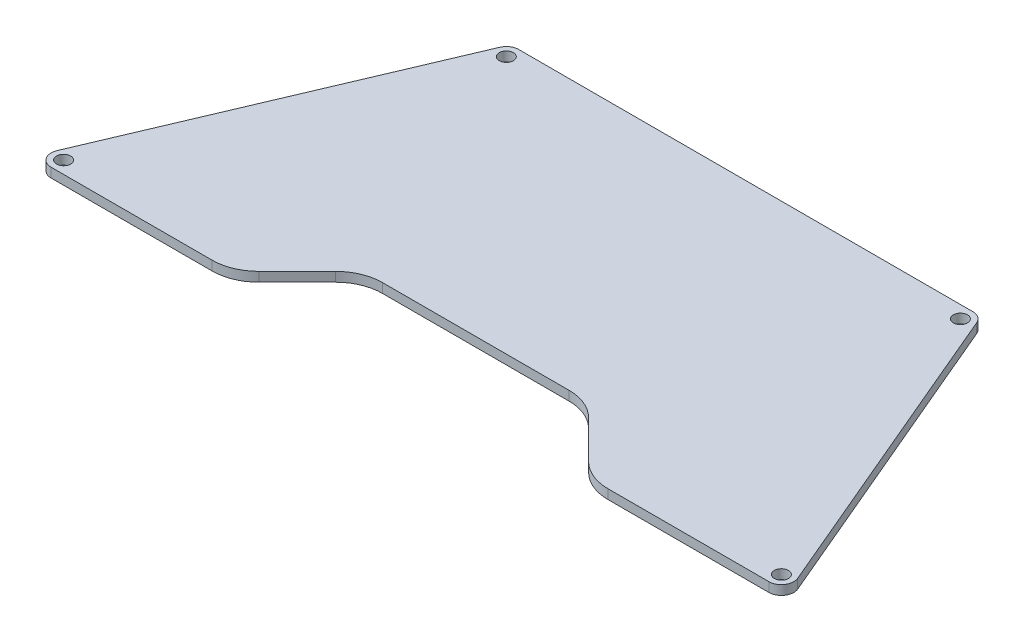
ISO-10303-21;
HEADER;
FILE_DESCRIPTION(('STEP AP214'),'2;1');
FILE_NAME('part.step','',(''),(''),'','','');
FILE_SCHEMA(('AUTOMOTIVE_DESIGN { 1 0 10303 214 1 1 1 1 }'));
ENDSEC;
DATA;
#1=APPLICATION_CONTEXT('core data for automotive mechanical design processes');
#2=APPLICATION_PROTOCOL_DEFINITION('international standard','automotive_design',2000,#1);
#3=PRODUCT_CONTEXT('',#1,'mechanical');
#4=PRODUCT('Part','Part','',(#3));
#5=PRODUCT_RELATED_PRODUCT_CATEGORY('part','',(#4));
#6=PRODUCT_DEFINITION_FORMATION('','',#4);
#7=PRODUCT_DEFINITION_CONTEXT('part definition',#1,'design');
#8=PRODUCT_DEFINITION('design','',#6,#7);
#9=PRODUCT_DEFINITION_SHAPE('','',#8);
#10=(LENGTH_UNIT() NAMED_UNIT(*) SI_UNIT(.MILLI.,.METRE.));
#11=(NAMED_UNIT(*) PLANE_ANGLE_UNIT() SI_UNIT($,.RADIAN.));
#12=(NAMED_UNIT(*) SI_UNIT($,.STERADIAN.) SOLID_ANGLE_UNIT());
#13=UNCERTAINTY_MEASURE_WITH_UNIT(LENGTH_MEASURE(1.E-05),#10,'distance_accuracy_value','');
#14=(GEOMETRIC_REPRESENTATION_CONTEXT(3) GLOBAL_UNCERTAINTY_ASSIGNED_CONTEXT((#13)) GLOBAL_UNIT_ASSIGNED_CONTEXT((#10,
#11,#12)) REPRESENTATION_CONTEXT('',''));
#15=CARTESIAN_POINT('',(0.,0.,0.));
#16=DIRECTION('',(0.,0.,1.));
#17=DIRECTION('',(1.,0.,0.));
#18=AXIS2_PLACEMENT_3D('',#15,#16,#17);
#19=CARTESIAN_POINT('',(118.532635623731,2.,-7.35));
#20=DIRECTION('',(0.,1.,0.));
#21=DIRECTION('',(0.,0.,1.));
#22=AXIS2_PLACEMENT_3D('',#19,#20,#21);
#23=CYLINDRICAL_SURFACE('',#22,10.);
#24=DIRECTION('',(0.,1.,0.));
#25=VECTOR('',#24,1.);
#26=CARTESIAN_POINT('',(111.461567811865,2.,-0.278932188134528));
#27=LINE('',#26,#25);
#28=CARTESIAN_POINT('',(111.461567811865,0.,-0.278932188134535));
#29=VERTEX_POINT('',#28);
#30=CARTESIAN_POINT('',(111.461567811865,2.,-0.278932188134535));
#31=VERTEX_POINT('',#30);
#32=EDGE_CURVE('E198',#29,#31,#27,.T.);
#33=ORIENTED_EDGE('',*,*,#32,.F.);
#34=CARTESIAN_POINT('',(118.532635623731,0.,-7.35));
#35=DIRECTION('',(0.,1.,0.));
#36=DIRECTION('',(0.,0.,1.));
#37=AXIS2_PLACEMENT_3D('',#34,#35,#36);
#38=CIRCLE('',#37,10.);
#39=CARTESIAN_POINT('',(118.532635623731,0.,2.65));
#40=VERTEX_POINT('',#39);
#41=EDGE_CURVE('E40',#40,#29,#38,.F.);
#42=ORIENTED_EDGE('',*,*,#41,.F.);
#43=DIRECTION('',(0.,1.,0.));
#44=VECTOR('',#43,1.);
#45=CARTESIAN_POINT('',(118.532635623731,2.,2.65));
#46=LINE('',#45,#44);
#47=CARTESIAN_POINT('',(118.532635623731,2.,2.65));
#48=VERTEX_POINT('',#47);
#49=EDGE_CURVE('E201',#48,#40,#46,.F.);
#50=ORIENTED_EDGE('',*,*,#49,.F.);
#51=CARTESIAN_POINT('',(118.532635623731,2.,-7.35));
#52=DIRECTION('',(0.,1.,0.));
#53=DIRECTION('',(0.,0.,1.));
#54=AXIS2_PLACEMENT_3D('',#51,#52,#53);
#55=CIRCLE('',#54,10.);
#56=EDGE_CURVE('E11',#31,#48,#55,.T.);
#57=ORIENTED_EDGE('',*,*,#56,.F.);
#58=EDGE_LOOP('',(#33,#42,#50,#57));
#59=FACE_BOUND('',#58,.T.);
#60=ADVANCED_FACE('F33',(#59),#23,.T.);
#61=CARTESIAN_POINT('',(96.248364376269,2.,-1.35));
#62=DIRECTION('',(0.,-1.,0.));
#63=DIRECTION('',(0.,0.,-1.));
#64=AXIS2_PLACEMENT_3D('',#61,#62,#63);
#65=CYLINDRICAL_SURFACE('',#64,10.);
#66=DIRECTION('',(0.,1.,0.));
#67=VECTOR('',#66,1.);
#68=CARTESIAN_POINT('',(96.248364376269,2.,-11.35));
#69=LINE('',#68,#67);
#70=CARTESIAN_POINT('',(96.2483643762691,0.,-11.35));
#71=VERTEX_POINT('',#70);
#72=CARTESIAN_POINT('',(96.2483643762691,2.,-11.35));
#73=VERTEX_POINT('',#72);
#74=EDGE_CURVE('E188',#71,#73,#69,.T.);
#75=ORIENTED_EDGE('',*,*,#74,.F.);
#76=CARTESIAN_POINT('',(96.248364376269,0.,-1.35));
#77=DIRECTION('',(0.,1.,0.));
#78=DIRECTION('',(0.,0.,1.));
#79=AXIS2_PLACEMENT_3D('',#76,#77,#78);
#80=CIRCLE('',#79,10.);
#81=CARTESIAN_POINT('',(103.319432188135,0.,-8.42106781186546));
#82=VERTEX_POINT('',#81);
#83=EDGE_CURVE('E194',#71,#82,#80,.F.);
#84=ORIENTED_EDGE('',*,*,#83,.T.);
#85=DIRECTION('',(0.,1.,0.));
#86=VECTOR('',#85,1.);
#87=CARTESIAN_POINT('',(103.319432188135,2.,-8.42106781186547));
#88=LINE('',#87,#86);
#89=CARTESIAN_POINT('',(103.319432188135,2.,-8.42106781186546));
#90=VERTEX_POINT('',#89);
#91=EDGE_CURVE('E191',#90,#82,#88,.F.);
#92=ORIENTED_EDGE('',*,*,#91,.F.);
#93=CARTESIAN_POINT('',(96.248364376269,2.,-1.35));
#94=DIRECTION('',(0.,1.,0.));
#95=DIRECTION('',(0.,0.,1.));
#96=AXIS2_PLACEMENT_3D('',#93,#94,#95);
#97=CIRCLE('',#96,10.);
#98=EDGE_CURVE('E196',#90,#73,#97,.T.);
#99=ORIENTED_EDGE('',*,*,#98,.T.);
#100=EDGE_LOOP('',(#75,#84,#92,#99));
#101=FACE_BOUND('',#100,.T.);
#102=ADVANCED_FACE('F318',(#101),#65,.F.);
#103=CARTESIAN_POINT('',(56.532635623731,2.,-1.35));
#104=DIRECTION('',(0.,-1.,0.));
#105=DIRECTION('',(0.,0.,-1.));
#106=AXIS2_PLACEMENT_3D('',#103,#104,#105);
#107=CYLINDRICAL_SURFACE('',#106,10.);
#108=DIRECTION('',(0.,1.,0.));
#109=VECTOR('',#108,1.);
#110=CARTESIAN_POINT('',(49.4615678118655,2.,-8.42106781186546));
#111=LINE('',#110,#109);
#112=CARTESIAN_POINT('',(49.4615678118655,0.,-8.42106781186546));
#113=VERTEX_POINT('',#112);
#114=CARTESIAN_POINT('',(49.4615678118655,2.,-8.42106781186546));
#115=VERTEX_POINT('',#114);
#116=EDGE_CURVE('E178',#113,#115,#111,.T.);
#117=ORIENTED_EDGE('',*,*,#116,.F.);
#118=CARTESIAN_POINT('',(56.532635623731,0.,-1.35));
#119=DIRECTION('',(0.,1.,0.));
#120=DIRECTION('',(0.,0.,1.));
#121=AXIS2_PLACEMENT_3D('',#118,#119,#120);
#122=CIRCLE('',#121,10.);
#123=CARTESIAN_POINT('',(56.532635623731,0.,-11.35));
#124=VERTEX_POINT('',#123);
#125=EDGE_CURVE('E184',#113,#124,#122,.F.);
#126=ORIENTED_EDGE('',*,*,#125,.T.);
#127=DIRECTION('',(0.,1.,0.));
#128=VECTOR('',#127,1.);
#129=CARTESIAN_POINT('',(56.532635623731,2.,-11.35));
#130=LINE('',#129,#128);
#131=CARTESIAN_POINT('',(56.532635623731,2.,-11.35));
#132=VERTEX_POINT('',#131);
#133=EDGE_CURVE('E181',#132,#124,#130,.F.);
#134=ORIENTED_EDGE('',*,*,#133,.F.);
#135=CARTESIAN_POINT('',(56.532635623731,2.,-1.35));
#136=DIRECTION('',(0.,1.,0.));
#137=DIRECTION('',(0.,0.,1.));
#138=AXIS2_PLACEMENT_3D('',#135,#136,#137);
#139=CIRCLE('',#138,10.);
#140=EDGE_CURVE('E186',#132,#115,#139,.T.);
#141=ORIENTED_EDGE('',*,*,#140,.T.);
#142=EDGE_LOOP('',(#117,#126,#134,#141));
#143=FACE_BOUND('',#142,.T.);
#144=ADVANCED_FACE('F275',(#143),#107,.F.);
#145=CARTESIAN_POINT('',(34.2483643762691,2.,-7.35));
#146=DIRECTION('',(0.,1.,0.));
#147=DIRECTION('',(0.,0.,1.));
#148=AXIS2_PLACEMENT_3D('',#145,#146,#147);
#149=CYLINDRICAL_SURFACE('',#148,10.);
#150=DIRECTION('',(0.,1.,0.));
#151=VECTOR('',#150,1.);
#152=CARTESIAN_POINT('',(34.2483643762691,2.,2.65));
#153=LINE('',#152,#151);
#154=CARTESIAN_POINT('',(34.2483643762691,0.,2.65));
#155=VERTEX_POINT('',#154);
#156=CARTESIAN_POINT('',(34.2483643762691,2.,2.65));
#157=VERTEX_POINT('',#156);
#158=EDGE_CURVE('E163',#155,#157,#153,.T.);
#159=ORIENTED_EDGE('',*,*,#158,.F.);
#160=CARTESIAN_POINT('',(34.2483643762691,0.,-7.35));
#161=DIRECTION('',(0.,1.,0.));
#162=DIRECTION('',(0.,0.,1.));
#163=AXIS2_PLACEMENT_3D('',#160,#161,#162);
#164=CIRCLE('',#163,10.);
#165=CARTESIAN_POINT('',(41.3194321881346,0.,-0.27893218813454));
#166=VERTEX_POINT('',#165);
#167=EDGE_CURVE('E174',#166,#155,#164,.F.);
#168=ORIENTED_EDGE('',*,*,#167,.F.);
#169=DIRECTION('',(0.,1.,0.));
#170=VECTOR('',#169,1.);
#171=CARTESIAN_POINT('',(41.3194321881346,2.,-0.278932188134544));
#172=LINE('',#171,#170);
#173=CARTESIAN_POINT('',(41.3194321881346,2.,-0.27893218813454));
#174=VERTEX_POINT('',#173);
#175=EDGE_CURVE('E166',#174,#166,#172,.F.);
#176=ORIENTED_EDGE('',*,*,#175,.F.);
#177=CARTESIAN_POINT('',(34.2483643762691,2.,-7.35));
#178=DIRECTION('',(0.,1.,0.));
#179=DIRECTION('',(0.,0.,1.));
#180=AXIS2_PLACEMENT_3D('',#177,#178,#179);
#181=CIRCLE('',#180,10.);
#182=EDGE_CURVE('E176',#157,#174,#181,.T.);
#183=ORIENTED_EDGE('',*,*,#182,.F.);
#184=EDGE_LOOP('',(#159,#168,#176,#183));
#185=FACE_BOUND('',#184,.T.);
#186=ADVANCED_FACE('F310',(#185),#149,.T.);
#187=CARTESIAN_POINT('',(152.781,2.,0.));
#188=DIRECTION('',(0.,1.,0.));
#189=DIRECTION('',(0.,0.,1.));
#190=AXIS2_PLACEMENT_3D('',#187,#188,#189);
#191=PLANE('',#190);
#192=DIRECTION('',(0.707106781186546,0.,0.707106781186549));
#193=VECTOR('',#192,1.);
#194=CARTESIAN_POINT('',(100.3905,2.,-11.35));
#195=LINE('',#194,#193);
#196=EDGE_CURVE('E222',#90,#31,#195,.T.);
#197=ORIENTED_EDGE('',*,*,#196,.T.);
#198=ORIENTED_EDGE('',*,*,#56,.T.);
#199=DIRECTION('',(1.,0.,0.));
#200=VECTOR('',#199,1.);
#201=CARTESIAN_POINT('',(114.3905,2.,2.65));
#202=LINE('',#201,#200);
#203=CARTESIAN_POINT('',(152.781,2.,2.65));
#204=VERTEX_POINT('',#203);
#205=EDGE_CURVE('E140',#48,#204,#202,.T.);
#206=ORIENTED_EDGE('',*,*,#205,.T.);
#207=CARTESIAN_POINT('',(152.781,2.,0.));
#208=DIRECTION('',(0.,1.,0.));
#209=DIRECTION('',(0.,0.,1.));
#210=AXIS2_PLACEMENT_3D('',#207,#208,#209);
#211=CIRCLE('',#210,2.65);
#212=CARTESIAN_POINT('',(155.220592734784,2.,-1.03483684143424));
#213=VERTEX_POINT('',#212);
#214=EDGE_CURVE('E144',#204,#213,#211,.T.);
#215=ORIENTED_EDGE('',*,*,#214,.T.);
#216=DIRECTION('',(-0.390504468465753,0.,-0.920601031993925));
#217=VECTOR('',#216,1.);
#218=CARTESIAN_POINT('',(127.153592734784,2.,-67.2018368414342));
#219=LINE('',#218,#217);
#220=CARTESIAN_POINT('',(127.153592734784,2.,-67.2018368414342));
#221=VERTEX_POINT('',#220);
#222=EDGE_CURVE('E157',#213,#221,#219,.T.);
#223=ORIENTED_EDGE('',*,*,#222,.T.);
#224=CARTESIAN_POINT('',(124.714,2.,-66.167));
#225=DIRECTION('',(0.,1.,0.));
#226=DIRECTION('',(0.,0.,-1.));
#227=AXIS2_PLACEMENT_3D('',#224,#225,#226);
#228=CIRCLE('',#227,2.65);
#229=CARTESIAN_POINT('',(124.714,2.,-68.817));
#230=VERTEX_POINT('',#229);
#231=EDGE_CURVE('E241',#221,#230,#228,.T.);
#232=ORIENTED_EDGE('',*,*,#231,.T.);
#233=DIRECTION('',(-1.,0.,0.));
#234=VECTOR('',#233,1.);
#235=CARTESIAN_POINT('',(28.067,2.,-68.817));
#236=LINE('',#235,#234);
#237=CARTESIAN_POINT('',(28.067,2.,-68.817));
#238=VERTEX_POINT('',#237);
#239=EDGE_CURVE('E292',#230,#238,#236,.T.);
#240=ORIENTED_EDGE('',*,*,#239,.T.);
#241=CARTESIAN_POINT('',(28.067,2.,-66.167));
#242=DIRECTION('',(0.,1.,0.));
#243=DIRECTION('',(0.,0.,1.));
#244=AXIS2_PLACEMENT_3D('',#241,#242,#243);
#245=CIRCLE('',#244,2.65);
#246=CARTESIAN_POINT('',(25.6274072652161,2.,-67.2018368414342));
#247=VERTEX_POINT('',#246);
#248=EDGE_CURVE('E296',#238,#247,#245,.T.);
#249=ORIENTED_EDGE('',*,*,#248,.T.);
#250=DIRECTION('',(-0.390504468465753,0.,0.920601031993925));
#251=VECTOR('',#250,1.);
#252=CARTESIAN_POINT('',(-2.4395927347839,2.,-1.03483684143425));
#253=LINE('',#252,#251);
#254=CARTESIAN_POINT('',(-2.4395927347839,2.,-1.03483684143425));
#255=VERTEX_POINT('',#254);
#256=EDGE_CURVE('E298',#247,#255,#253,.T.);
#257=ORIENTED_EDGE('',*,*,#256,.T.);
#258=CARTESIAN_POINT('',(0.,2.,0.));
#259=DIRECTION('',(0.,1.,0.));
#260=DIRECTION('',(0.,0.,1.));
#261=AXIS2_PLACEMENT_3D('',#258,#259,#260);
#262=CIRCLE('',#261,2.65);
#263=CARTESIAN_POINT('',(0.,2.,2.65));
#264=VERTEX_POINT('',#263);
#265=EDGE_CURVE('E284',#255,#264,#262,.T.);
#266=ORIENTED_EDGE('',*,*,#265,.T.);
#267=DIRECTION('',(1.,0.,0.));
#268=VECTOR('',#267,1.);
#269=CARTESIAN_POINT('',(0.,2.,2.65));
#270=LINE('',#269,#268);
#271=EDGE_CURVE('E281',#264,#157,#270,.T.);
#272=ORIENTED_EDGE('',*,*,#271,.T.);
#273=ORIENTED_EDGE('',*,*,#182,.T.);
#274=DIRECTION('',(0.707106781186546,0.,-0.707106781186549));
#275=VECTOR('',#274,1.);
#276=CARTESIAN_POINT('',(52.3905,2.,-11.35));
#277=LINE('',#276,#275);
#278=EDGE_CURVE('E279',#174,#115,#277,.T.);
#279=ORIENTED_EDGE('',*,*,#278,.T.);
#280=ORIENTED_EDGE('',*,*,#140,.F.);
#281=DIRECTION('',(1.,0.,0.));
#282=VECTOR('',#281,1.);
#283=CARTESIAN_POINT('',(100.3905,2.,-11.35));
#284=LINE('',#283,#282);
#285=EDGE_CURVE('E278',#132,#73,#284,.T.);
#286=ORIENTED_EDGE('',*,*,#285,.T.);
#287=ORIENTED_EDGE('',*,*,#98,.F.);
#288=EDGE_LOOP('',(#197,#198,#206,#215,#223,#232,#240,#249,#257,#266,#272,#273,#279,#280,#286,#287));
#289=FACE_BOUND('',#288,.T.);
#290=CARTESIAN_POINT('',(28.067,2.,-66.167));
#291=DIRECTION('',(0.,1.,0.));
#292=DIRECTION('',(0.,0.,1.));
#293=AXIS2_PLACEMENT_3D('',#290,#291,#292);
#294=CIRCLE('',#293,1.5);
#295=CARTESIAN_POINT('',(28.067,2.,-64.667));
#296=VERTEX_POINT('',#295);
#297=EDGE_CURVE('E398',#296,#296,#294,.T.);
#298=ORIENTED_EDGE('',*,*,#297,.F.);
#299=EDGE_LOOP('',(#298));
#300=FACE_BOUND('',#299,.T.);
#301=CARTESIAN_POINT('',(0.,2.,0.));
#302=DIRECTION('',(0.,1.,0.));
#303=DIRECTION('',(0.,0.,1.));
#304=AXIS2_PLACEMENT_3D('',#301,#302,#303);
#305=CIRCLE('',#304,1.5);
#306=CARTESIAN_POINT('',(0.,2.,1.5));
#307=VERTEX_POINT('',#306);
#308=EDGE_CURVE('E289',#307,#307,#305,.T.);
#309=ORIENTED_EDGE('',*,*,#308,.F.);
#310=EDGE_LOOP('',(#309));
#311=FACE_BOUND('',#310,.T.);
#312=CARTESIAN_POINT('',(152.781,2.,0.));
#313=DIRECTION('',(0.,1.,0.));
#314=DIRECTION('',(0.,0.,1.));
#315=AXIS2_PLACEMENT_3D('',#312,#313,#314);
#316=CIRCLE('',#315,1.5);
#317=CARTESIAN_POINT('',(152.781,2.,1.5));
#318=VERTEX_POINT('',#317);
#319=EDGE_CURVE('E404',#318,#318,#316,.T.);
#320=ORIENTED_EDGE('',*,*,#319,.F.);
#321=EDGE_LOOP('',(#320));
#322=FACE_BOUND('',#321,.T.);
#323=CARTESIAN_POINT('',(124.714,2.,-66.167));
#324=DIRECTION('',(0.,1.,0.));
#325=DIRECTION('',(0.,0.,-1.));
#326=AXIS2_PLACEMENT_3D('',#323,#324,#325);
#327=CIRCLE('',#326,1.50000000000001);
#328=CARTESIAN_POINT('',(124.714,2.,-67.667));
#329=VERTEX_POINT('',#328);
#330=EDGE_CURVE('E389',#329,#329,#327,.T.);
#331=ORIENTED_EDGE('',*,*,#330,.F.);
#332=EDGE_LOOP('',(#331));
#333=FACE_BOUND('',#332,.T.);
#334=ADVANCED_FACE('F142',(#289,#300,#311,#322,#333),#191,.T.);
#335=CARTESIAN_POINT('',(152.781,0.,0.));
#336=DIRECTION('',(0.,1.,0.));
#337=DIRECTION('',(0.,0.,1.));
#338=AXIS2_PLACEMENT_3D('',#335,#336,#337);
#339=PLANE('',#338);
#340=DIRECTION('',(1.,0.,0.));
#341=VECTOR('',#340,1.);
#342=CARTESIAN_POINT('',(114.3905,0.,2.65));
#343=LINE('',#342,#341);
#344=CARTESIAN_POINT('',(152.781,0.,2.65));
#345=VERTEX_POINT('',#344);
#346=EDGE_CURVE('E161',#40,#345,#343,.T.);
#347=ORIENTED_EDGE('',*,*,#346,.F.);
#348=ORIENTED_EDGE('',*,*,#41,.T.);
#349=DIRECTION('',(0.707106781186546,0.,0.707106781186549));
#350=VECTOR('',#349,1.);
#351=CARTESIAN_POINT('',(100.3905,0.,-11.35));
#352=LINE('',#351,#350);
#353=EDGE_CURVE('E148',#82,#29,#352,.T.);
#354=ORIENTED_EDGE('',*,*,#353,.F.);
#355=ORIENTED_EDGE('',*,*,#83,.F.);
#356=DIRECTION('',(1.,0.,0.));
#357=VECTOR('',#356,1.);
#358=CARTESIAN_POINT('',(100.3905,0.,-11.35));
#359=LINE('',#358,#357);
#360=EDGE_CURVE('E211',#124,#71,#359,.T.);
#361=ORIENTED_EDGE('',*,*,#360,.F.);
#362=ORIENTED_EDGE('',*,*,#125,.F.);
#363=DIRECTION('',(0.707106781186546,0.,-0.707106781186549));
#364=VECTOR('',#363,1.);
#365=CARTESIAN_POINT('',(52.3905,0.,-11.35));
#366=LINE('',#365,#364);
#367=EDGE_CURVE('E214',#166,#113,#366,.T.);
#368=ORIENTED_EDGE('',*,*,#367,.F.);
#369=ORIENTED_EDGE('',*,*,#167,.T.);
#370=DIRECTION('',(1.,0.,0.));
#371=VECTOR('',#370,1.);
#372=CARTESIAN_POINT('',(0.,0.,2.65));
#373=LINE('',#372,#371);
#374=CARTESIAN_POINT('',(0.,0.,2.65));
#375=VERTEX_POINT('',#374);
#376=EDGE_CURVE('E260',#375,#155,#373,.T.);
#377=ORIENTED_EDGE('',*,*,#376,.F.);
#378=CARTESIAN_POINT('',(0.,0.,0.));
#379=DIRECTION('',(0.,1.,0.));
#380=DIRECTION('',(0.,0.,1.));
#381=AXIS2_PLACEMENT_3D('',#378,#379,#380);
#382=CIRCLE('',#381,2.65);
#383=CARTESIAN_POINT('',(-2.4395927347839,0.,-1.03483684143425));
#384=VERTEX_POINT('',#383);
#385=EDGE_CURVE('E258',#384,#375,#382,.T.);
#386=ORIENTED_EDGE('',*,*,#385,.F.);
#387=DIRECTION('',(-0.390504468465753,0.,0.920601031993925));
#388=VECTOR('',#387,1.);
#389=CARTESIAN_POINT('',(-2.4395927347839,0.,-1.03483684143425));
#390=LINE('',#389,#388);
#391=CARTESIAN_POINT('',(25.6274072652161,0.,-67.2018368414342));
#392=VERTEX_POINT('',#391);
#393=EDGE_CURVE('E256',#392,#384,#390,.T.);
#394=ORIENTED_EDGE('',*,*,#393,.F.);
#395=CARTESIAN_POINT('',(28.067,0.,-66.167));
#396=DIRECTION('',(0.,1.,0.));
#397=DIRECTION('',(0.,0.,1.));
#398=AXIS2_PLACEMENT_3D('',#395,#396,#397);
#399=CIRCLE('',#398,2.65);
#400=CARTESIAN_POINT('',(28.067,0.,-68.817));
#401=VERTEX_POINT('',#400);
#402=EDGE_CURVE('E249',#401,#392,#399,.T.);
#403=ORIENTED_EDGE('',*,*,#402,.F.);
#404=DIRECTION('',(-1.,0.,0.));
#405=VECTOR('',#404,1.);
#406=CARTESIAN_POINT('',(28.067,0.,-68.817));
#407=LINE('',#406,#405);
#408=CARTESIAN_POINT('',(124.714,0.,-68.817));
#409=VERTEX_POINT('',#408);
#410=EDGE_CURVE('E247',#409,#401,#407,.T.);
#411=ORIENTED_EDGE('',*,*,#410,.F.);
#412=CARTESIAN_POINT('',(124.714,0.,-66.167));
#413=DIRECTION('',(0.,1.,0.));
#414=DIRECTION('',(0.,0.,-1.));
#415=AXIS2_PLACEMENT_3D('',#412,#413,#414);
#416=CIRCLE('',#415,2.65);
#417=CARTESIAN_POINT('',(127.153592734784,0.,-67.2018368414342));
#418=VERTEX_POINT('',#417);
#419=EDGE_CURVE('E240',#418,#409,#416,.T.);
#420=ORIENTED_EDGE('',*,*,#419,.F.);
#421=DIRECTION('',(-0.390504468465753,0.,-0.920601031993925));
#422=VECTOR('',#421,1.);
#423=CARTESIAN_POINT('',(127.153592734784,0.,-67.2018368414342));
#424=LINE('',#423,#422);
#425=CARTESIAN_POINT('',(155.220592734784,0.,-1.03483684143424));
#426=VERTEX_POINT('',#425);
#427=EDGE_CURVE('E245',#426,#418,#424,.T.);
#428=ORIENTED_EDGE('',*,*,#427,.F.);
#429=CARTESIAN_POINT('',(152.781,0.,0.));
#430=DIRECTION('',(0.,1.,0.));
#431=DIRECTION('',(0.,0.,1.));
#432=AXIS2_PLACEMENT_3D('',#429,#430,#431);
#433=CIRCLE('',#432,2.65);
#434=EDGE_CURVE('E251',#345,#426,#433,.T.);
#435=ORIENTED_EDGE('',*,*,#434,.F.);
#436=EDGE_LOOP('',(#347,#348,#354,#355,#361,#362,#368,#369,#377,#386,#394,#403,#411,#420,#428,#435));
#437=FACE_BOUND('',#436,.T.);
#438=CARTESIAN_POINT('',(0.,0.,0.));
#439=DIRECTION('',(0.,1.,0.));
#440=DIRECTION('',(0.,0.,1.));
#441=AXIS2_PLACEMENT_3D('',#438,#439,#440);
#442=CIRCLE('',#441,1.5);
#443=CARTESIAN_POINT('',(0.,0.,1.5));
#444=VERTEX_POINT('',#443);
#445=EDGE_CURVE('E407',#444,#444,#442,.T.);
#446=ORIENTED_EDGE('',*,*,#445,.T.);
#447=EDGE_LOOP('',(#446));
#448=FACE_BOUND('',#447,.T.);
#449=CARTESIAN_POINT('',(152.781,0.,0.));
#450=DIRECTION('',(0.,1.,0.));
#451=DIRECTION('',(0.,0.,1.));
#452=AXIS2_PLACEMENT_3D('',#449,#450,#451);
#453=CIRCLE('',#452,1.5);
#454=CARTESIAN_POINT('',(152.781,0.,1.5));
#455=VERTEX_POINT('',#454);
#456=EDGE_CURVE('E401',#455,#455,#453,.T.);
#457=ORIENTED_EDGE('',*,*,#456,.T.);
#458=EDGE_LOOP('',(#457));
#459=FACE_BOUND('',#458,.T.);
#460=CARTESIAN_POINT('',(28.067,0.,-66.167));
#461=DIRECTION('',(0.,1.,0.));
#462=DIRECTION('',(0.,0.,1.));
#463=AXIS2_PLACEMENT_3D('',#460,#461,#462);
#464=CIRCLE('',#463,1.5);
#465=CARTESIAN_POINT('',(28.067,0.,-64.667));
#466=VERTEX_POINT('',#465);
#467=EDGE_CURVE('E395',#466,#466,#464,.T.);
#468=ORIENTED_EDGE('',*,*,#467,.T.);
#469=EDGE_LOOP('',(#468));
#470=FACE_BOUND('',#469,.T.);
#471=CARTESIAN_POINT('',(124.714,0.,-66.167));
#472=DIRECTION('',(0.,1.,0.));
#473=DIRECTION('',(0.,0.,-1.));
#474=AXIS2_PLACEMENT_3D('',#471,#472,#473);
#475=CIRCLE('',#474,1.50000000000001);
#476=CARTESIAN_POINT('',(124.714,0.,-67.667));
#477=VERTEX_POINT('',#476);
#478=EDGE_CURVE('E392',#477,#477,#475,.T.);
#479=ORIENTED_EDGE('',*,*,#478,.T.);
#480=EDGE_LOOP('',(#479));
#481=FACE_BOUND('',#480,.T.);
#482=ADVANCED_FACE('F204',(#437,#448,#459,#470,#481),#339,.F.);
#483=CARTESIAN_POINT('',(114.3905,2.,2.65));
#484=DIRECTION('',(0.,0.,-1.));
#485=DIRECTION('',(-1.,0.,0.));
#486=AXIS2_PLACEMENT_3D('',#483,#484,#485);
#487=PLANE('',#486);
#488=ORIENTED_EDGE('',*,*,#205,.F.);
#489=ORIENTED_EDGE('',*,*,#49,.T.);
#490=ORIENTED_EDGE('',*,*,#346,.T.);
#491=DIRECTION('',(0.,-1.,0.));
#492=VECTOR('',#491,1.);
#493=CARTESIAN_POINT('',(152.781,2.,2.65));
#494=LINE('',#493,#492);
#495=EDGE_CURVE('E153',#204,#345,#494,.T.);
#496=ORIENTED_EDGE('',*,*,#495,.F.);
#497=EDGE_LOOP('',(#488,#489,#490,#496));
#498=FACE_BOUND('',#497,.T.);
#499=ADVANCED_FACE('F159',(#498),#487,.F.);
#500=CARTESIAN_POINT('',(152.781,2.,0.));
#501=DIRECTION('',(0.,-1.,0.));
#502=DIRECTION('',(0.,0.,-1.));
#503=AXIS2_PLACEMENT_3D('',#500,#501,#502);
#504=CYLINDRICAL_SURFACE('',#503,2.65);
#505=ORIENTED_EDGE('',*,*,#434,.T.);
#506=DIRECTION('',(0.,-1.,0.));
#507=VECTOR('',#506,1.);
#508=CARTESIAN_POINT('',(155.220592734784,2.,-1.03483684143424));
#509=LINE('',#508,#507);
#510=EDGE_CURVE('E155',#213,#426,#509,.T.);
#511=ORIENTED_EDGE('',*,*,#510,.F.);
#512=ORIENTED_EDGE('',*,*,#214,.F.);
#513=ORIENTED_EDGE('',*,*,#495,.T.);
#514=EDGE_LOOP('',(#505,#511,#512,#513));
#515=FACE_BOUND('',#514,.T.);
#516=ADVANCED_FACE('F152',(#515),#504,.T.);
#517=CARTESIAN_POINT('',(127.153592734784,2.,-67.2018368414342));
#518=DIRECTION('',(-0.920601031993925,0.,0.390504468465753));
#519=DIRECTION('',(0.390504468465753,0.,0.920601031993925));
#520=AXIS2_PLACEMENT_3D('',#517,#518,#519);
#521=PLANE('',#520);
#522=ORIENTED_EDGE('',*,*,#427,.T.);
#523=DIRECTION('',(0.,-1.,0.));
#524=VECTOR('',#523,1.);
#525=CARTESIAN_POINT('',(127.153592734784,2.,-67.2018368414342));
#526=LINE('',#525,#524);
#527=EDGE_CURVE('E168',#221,#418,#526,.T.);
#528=ORIENTED_EDGE('',*,*,#527,.F.);
#529=ORIENTED_EDGE('',*,*,#222,.F.);
#530=ORIENTED_EDGE('',*,*,#510,.T.);
#531=EDGE_LOOP('',(#522,#528,#529,#530));
#532=FACE_BOUND('',#531,.T.);
#533=ADVANCED_FACE('F290',(#532),#521,.F.);
#534=CARTESIAN_POINT('',(124.714,2.,-66.167));
#535=DIRECTION('',(0.,-1.,0.));
#536=DIRECTION('',(0.,0.,-1.));
#537=AXIS2_PLACEMENT_3D('',#534,#535,#536);
#538=CYLINDRICAL_SURFACE('',#537,2.65);
#539=ORIENTED_EDGE('',*,*,#419,.T.);
#540=DIRECTION('',(0.,-1.,0.));
#541=VECTOR('',#540,1.);
#542=CARTESIAN_POINT('',(124.714,2.,-68.817));
#543=LINE('',#542,#541);
#544=EDGE_CURVE('E231',#230,#409,#543,.T.);
#545=ORIENTED_EDGE('',*,*,#544,.F.);
#546=ORIENTED_EDGE('',*,*,#231,.F.);
#547=ORIENTED_EDGE('',*,*,#527,.T.);
#548=EDGE_LOOP('',(#539,#545,#546,#547));
#549=FACE_BOUND('',#548,.T.);
#550=ADVANCED_FACE('F238',(#549),#538,.T.);
#551=CARTESIAN_POINT('',(28.067,2.,-68.817));
#552=DIRECTION('',(0.,0.,1.));
#553=DIRECTION('',(1.,0.,0.));
#554=AXIS2_PLACEMENT_3D('',#551,#552,#553);
#555=PLANE('',#554);
#556=ORIENTED_EDGE('',*,*,#410,.T.);
#557=DIRECTION('',(0.,-1.,0.));
#558=VECTOR('',#557,1.);
#559=CARTESIAN_POINT('',(28.067,2.,-68.817));
#560=LINE('',#559,#558);
#561=EDGE_CURVE('E228',#238,#401,#560,.T.);
#562=ORIENTED_EDGE('',*,*,#561,.F.);
#563=ORIENTED_EDGE('',*,*,#239,.F.);
#564=ORIENTED_EDGE('',*,*,#544,.T.);
#565=EDGE_LOOP('',(#556,#562,#563,#564));
#566=FACE_BOUND('',#565,.T.);
#567=ADVANCED_FACE('F353',(#566),#555,.F.);
#568=CARTESIAN_POINT('',(28.067,2.,-66.167));
#569=DIRECTION('',(0.,-1.,0.));
#570=DIRECTION('',(0.,0.,-1.));
#571=AXIS2_PLACEMENT_3D('',#568,#569,#570);
#572=CYLINDRICAL_SURFACE('',#571,2.65);
#573=ORIENTED_EDGE('',*,*,#402,.T.);
#574=DIRECTION('',(0.,-1.,0.));
#575=VECTOR('',#574,1.);
#576=CARTESIAN_POINT('',(25.6274072652161,2.,-67.2018368414342));
#577=LINE('',#576,#575);
#578=EDGE_CURVE('E225',#247,#392,#577,.T.);
#579=ORIENTED_EDGE('',*,*,#578,.F.);
#580=ORIENTED_EDGE('',*,*,#248,.F.);
#581=ORIENTED_EDGE('',*,*,#561,.T.);
#582=EDGE_LOOP('',(#573,#579,#580,#581));
#583=FACE_BOUND('',#582,.T.);
#584=ADVANCED_FACE('F349',(#583),#572,.T.);
#585=CARTESIAN_POINT('',(-2.4395927347839,2.,-1.03483684143425));
#586=DIRECTION('',(0.920601031993925,0.,0.390504468465753));
#587=DIRECTION('',(0.390504468465753,0.,-0.920601031993925));
#588=AXIS2_PLACEMENT_3D('',#585,#586,#587);
#589=PLANE('',#588);
#590=ORIENTED_EDGE('',*,*,#393,.T.);
#591=DIRECTION('',(0.,-1.,0.));
#592=VECTOR('',#591,1.);
#593=CARTESIAN_POINT('',(-2.4395927347839,2.,-1.03483684143425));
#594=LINE('',#593,#592);
#595=EDGE_CURVE('E221',#255,#384,#594,.T.);
#596=ORIENTED_EDGE('',*,*,#595,.F.);
#597=ORIENTED_EDGE('',*,*,#256,.F.);
#598=ORIENTED_EDGE('',*,*,#578,.T.);
#599=EDGE_LOOP('',(#590,#596,#597,#598));
#600=FACE_BOUND('',#599,.T.);
#601=ADVANCED_FACE('F346',(#600),#589,.F.);
#602=CARTESIAN_POINT('',(0.,2.,0.));
#603=DIRECTION('',(0.,-1.,0.));
#604=DIRECTION('',(0.,0.,-1.));
#605=AXIS2_PLACEMENT_3D('',#602,#603,#604);
#606=CYLINDRICAL_SURFACE('',#605,2.65);
#607=ORIENTED_EDGE('',*,*,#385,.T.);
#608=DIRECTION('',(0.,-1.,0.));
#609=VECTOR('',#608,1.);
#610=CARTESIAN_POINT('',(0.,2.,2.65));
#611=LINE('',#610,#609);
#612=EDGE_CURVE('E218',#264,#375,#611,.T.);
#613=ORIENTED_EDGE('',*,*,#612,.F.);
#614=ORIENTED_EDGE('',*,*,#265,.F.);
#615=ORIENTED_EDGE('',*,*,#595,.T.);
#616=EDGE_LOOP('',(#607,#613,#614,#615));
#617=FACE_BOUND('',#616,.T.);
#618=ADVANCED_FACE('F305',(#617),#606,.T.);
#619=CARTESIAN_POINT('',(0.,2.,2.65));
#620=DIRECTION('',(0.,0.,-1.));
#621=DIRECTION('',(-1.,0.,0.));
#622=AXIS2_PLACEMENT_3D('',#619,#620,#621);
#623=PLANE('',#622);
#624=ORIENTED_EDGE('',*,*,#376,.T.);
#625=ORIENTED_EDGE('',*,*,#158,.T.);
#626=ORIENTED_EDGE('',*,*,#271,.F.);
#627=ORIENTED_EDGE('',*,*,#612,.T.);
#628=EDGE_LOOP('',(#624,#625,#626,#627));
#629=FACE_BOUND('',#628,.T.);
#630=ADVANCED_FACE('F308',(#629),#623,.F.);
#631=CARTESIAN_POINT('',(52.3905,2.,-11.35));
#632=DIRECTION('',(-0.707106781186549,0.,-0.707106781186546));
#633=DIRECTION('',(-0.707106781186546,0.,0.707106781186549));
#634=AXIS2_PLACEMENT_3D('',#631,#632,#633);
#635=PLANE('',#634);
#636=ORIENTED_EDGE('',*,*,#367,.T.);
#637=ORIENTED_EDGE('',*,*,#116,.T.);
#638=ORIENTED_EDGE('',*,*,#278,.F.);
#639=ORIENTED_EDGE('',*,*,#175,.T.);
#640=EDGE_LOOP('',(#636,#637,#638,#639));
#641=FACE_BOUND('',#640,.T.);
#642=ADVANCED_FACE('F265',(#641),#635,.F.);
#643=CARTESIAN_POINT('',(100.3905,2.,-11.35));
#644=DIRECTION('',(0.,0.,-1.));
#645=DIRECTION('',(-1.,0.,0.));
#646=AXIS2_PLACEMENT_3D('',#643,#644,#645);
#647=PLANE('',#646);
#648=ORIENTED_EDGE('',*,*,#360,.T.);
#649=ORIENTED_EDGE('',*,*,#74,.T.);
#650=ORIENTED_EDGE('',*,*,#285,.F.);
#651=ORIENTED_EDGE('',*,*,#133,.T.);
#652=EDGE_LOOP('',(#648,#649,#650,#651));
#653=FACE_BOUND('',#652,.T.);
#654=ADVANCED_FACE('F330',(#653),#647,.F.);
#655=CARTESIAN_POINT('',(100.3905,2.,-11.35));
#656=DIRECTION('',(0.707106781186549,0.,-0.707106781186546));
#657=DIRECTION('',(-0.707106781186546,0.,-0.707106781186549));
#658=AXIS2_PLACEMENT_3D('',#655,#656,#657);
#659=PLANE('',#658);
#660=ORIENTED_EDGE('',*,*,#353,.T.);
#661=ORIENTED_EDGE('',*,*,#32,.T.);
#662=ORIENTED_EDGE('',*,*,#196,.F.);
#663=ORIENTED_EDGE('',*,*,#91,.T.);
#664=EDGE_LOOP('',(#660,#661,#662,#663));
#665=FACE_BOUND('',#664,.T.);
#666=ADVANCED_FACE('F209',(#665),#659,.F.);
#667=CARTESIAN_POINT('',(0.,2.,0.));
#668=DIRECTION('',(0.,-1.,0.));
#669=DIRECTION('',(0.,0.,-1.));
#670=AXIS2_PLACEMENT_3D('',#667,#668,#669);
#671=CYLINDRICAL_SURFACE('',#670,1.5);
#672=ORIENTED_EDGE('',*,*,#308,.T.);
#673=EDGE_LOOP('',(#672));
#674=FACE_BOUND('',#673,.T.);
#675=ORIENTED_EDGE('',*,*,#445,.F.);
#676=EDGE_LOOP('',(#675));
#677=FACE_BOUND('',#676,.T.);
#678=ADVANCED_FACE('F337',(#674,#677),#671,.F.);
#679=CARTESIAN_POINT('',(152.781,2.,0.));
#680=DIRECTION('',(0.,-1.,0.));
#681=DIRECTION('',(0.,0.,-1.));
#682=AXIS2_PLACEMENT_3D('',#679,#680,#681);
#683=CYLINDRICAL_SURFACE('',#682,1.5);
#684=ORIENTED_EDGE('',*,*,#319,.T.);
#685=EDGE_LOOP('',(#684));
#686=FACE_BOUND('',#685,.T.);
#687=ORIENTED_EDGE('',*,*,#456,.F.);
#688=EDGE_LOOP('',(#687));
#689=FACE_BOUND('',#688,.T.);
#690=ADVANCED_FACE('F372',(#686,#689),#683,.F.);
#691=CARTESIAN_POINT('',(28.067,2.,-66.167));
#692=DIRECTION('',(0.,-1.,0.));
#693=DIRECTION('',(0.,0.,-1.));
#694=AXIS2_PLACEMENT_3D('',#691,#692,#693);
#695=CYLINDRICAL_SURFACE('',#694,1.5);
#696=ORIENTED_EDGE('',*,*,#297,.T.);
#697=EDGE_LOOP('',(#696));
#698=FACE_BOUND('',#697,.T.);
#699=ORIENTED_EDGE('',*,*,#467,.F.);
#700=EDGE_LOOP('',(#699));
#701=FACE_BOUND('',#700,.T.);
#702=ADVANCED_FACE('F376',(#698,#701),#695,.F.);
#703=CARTESIAN_POINT('',(124.714,2.,-66.167));
#704=DIRECTION('',(0.,-1.,0.));
#705=DIRECTION('',(0.,0.,-1.));
#706=AXIS2_PLACEMENT_3D('',#703,#704,#705);
#707=CYLINDRICAL_SURFACE('',#706,1.50000000000001);
#708=ORIENTED_EDGE('',*,*,#330,.T.);
#709=EDGE_LOOP('',(#708));
#710=FACE_BOUND('',#709,.T.);
#711=ORIENTED_EDGE('',*,*,#478,.F.);
#712=EDGE_LOOP('',(#711));
#713=FACE_BOUND('',#712,.T.);
#714=ADVANCED_FACE('F380',(#710,#713),#707,.F.);
#715=CLOSED_SHELL('',(#60,#102,#144,#186,#334,#482,#499,#516,#533,#550,#567,#584,#601,#618,#630,
#642,#654,#666,#678,#690,#702,#714));
#716=MANIFOLD_SOLID_BREP('B2',#715);
#717=ADVANCED_BREP_SHAPE_REPRESENTATION('',(#18,#716),#14);
#718=SHAPE_DEFINITION_REPRESENTATION(#9,#717);
ENDSEC;
END-ISO-10303-21;
